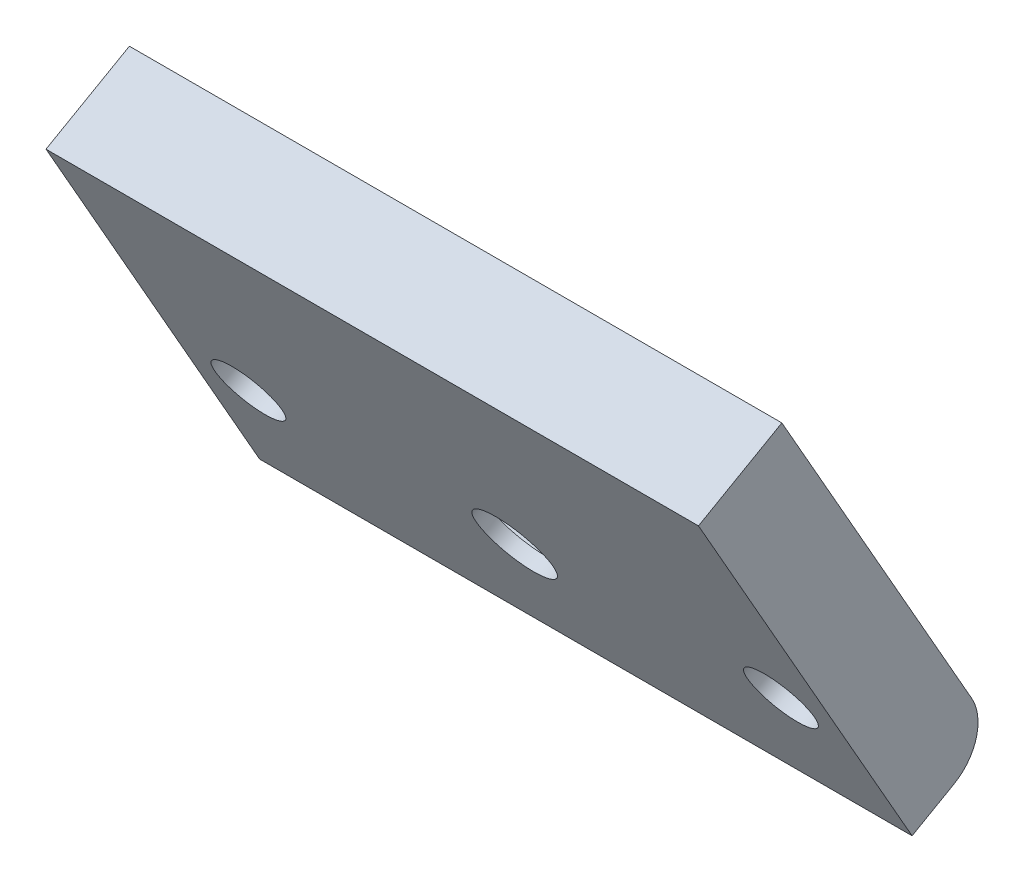
ISO-10303-21;
HEADER;
FILE_DESCRIPTION(('STEP AP214'),'2;1');
FILE_NAME('part.step','',(''),(''),'','','');
FILE_SCHEMA(('AUTOMOTIVE_DESIGN { 1 0 10303 214 1 1 1 1 }'));
ENDSEC;
DATA;
#1=APPLICATION_CONTEXT('core data for automotive mechanical design processes');
#2=APPLICATION_PROTOCOL_DEFINITION('international standard','automotive_design',2000,#1);
#3=PRODUCT_CONTEXT('',#1,'mechanical');
#4=PRODUCT('Part','Part','',(#3));
#5=PRODUCT_RELATED_PRODUCT_CATEGORY('part','',(#4));
#6=PRODUCT_DEFINITION_FORMATION('','',#4);
#7=PRODUCT_DEFINITION_CONTEXT('part definition',#1,'design');
#8=PRODUCT_DEFINITION('design','',#6,#7);
#9=PRODUCT_DEFINITION_SHAPE('','',#8);
#10=(LENGTH_UNIT() NAMED_UNIT(*) SI_UNIT(.MILLI.,.METRE.));
#11=(NAMED_UNIT(*) PLANE_ANGLE_UNIT() SI_UNIT($,.RADIAN.));
#12=(NAMED_UNIT(*) SI_UNIT($,.STERADIAN.) SOLID_ANGLE_UNIT());
#13=UNCERTAINTY_MEASURE_WITH_UNIT(LENGTH_MEASURE(1.E-05),#10,'distance_accuracy_value','');
#14=(GEOMETRIC_REPRESENTATION_CONTEXT(3) GLOBAL_UNCERTAINTY_ASSIGNED_CONTEXT((#13)) GLOBAL_UNIT_ASSIGNED_CONTEXT((#10,
#11,#12)) REPRESENTATION_CONTEXT('',''));
#15=CARTESIAN_POINT('',(0.,0.,0.));
#16=DIRECTION('',(0.,0.,1.));
#17=DIRECTION('',(1.,0.,0.));
#18=AXIS2_PLACEMENT_3D('',#15,#16,#17);
#19=CARTESIAN_POINT('',(0.,63.9753871113085,-6.9269396750915));
#20=DIRECTION('',(0.,-0.494736971942379,0.869042765687216));
#21=DIRECTION('',(0.,-0.869042765687216,-0.494736971942379));
#22=AXIS2_PLACEMENT_3D('',#19,#20,#21);
#23=CYLINDRICAL_SURFACE('',#22,4.00000000000001);
#24=CARTESIAN_POINT('',(0.,57.0490695041152,5.23965904452954));
#25=DIRECTION('',(0.,-0.494736971942379,0.869042765687216));
#26=DIRECTION('',(0.,-0.869042765687216,-0.494736971942379));
#27=AXIS2_PLACEMENT_3D('',#24,#25,#26);
#28=CIRCLE('',#27,4.00000000000001);
#29=CARTESIAN_POINT('',(0.,53.5728984413663,3.26071115676001));
#30=VERTEX_POINT('',#29);
#31=EDGE_CURVE('E162',#30,#30,#28,.T.);
#32=ORIENTED_EDGE('',*,*,#31,.F.);
#33=EDGE_LOOP('',(#32));
#34=FACE_BOUND('',#33,.T.);
#35=CARTESIAN_POINT('',(0.,56.3069640462016,6.54322319306035));
#36=DIRECTION('',(0.,-0.494736971942379,0.869042765687216));
#37=DIRECTION('',(0.,-0.869042765687216,-0.494736971942379));
#38=AXIS2_PLACEMENT_3D('',#35,#36,#37);
#39=CIRCLE('',#38,4.00000000000001);
#40=CARTESIAN_POINT('',(0.,52.8307929834527,4.56427530529083));
#41=VERTEX_POINT('',#40);
#42=EDGE_CURVE('E49',#41,#41,#39,.T.);
#43=ORIENTED_EDGE('',*,*,#42,.T.);
#44=EDGE_LOOP('',(#43));
#45=FACE_BOUND('',#44,.T.);
#46=ADVANCED_FACE('F44',(#34,#45),#23,.F.);
#47=CARTESIAN_POINT('',(0.,32.3026100272467,18.3895385839591));
#48=DIRECTION('',(0.,0.869042765687216,0.494736971942379));
#49=DIRECTION('',(0.,-0.494736971942379,0.869042765687216));
#50=AXIS2_PLACEMENT_3D('',#47,#48,#49);
#51=PLANE('',#50);
#52=CARTESIAN_POINT('',(-17.5,45.2502704486629,-4.3540024488242));
#53=DIRECTION('',(0.,0.869042765687216,0.494736971942379));
#54=DIRECTION('',(0.,-0.494736971942379,0.869042765687216));
#55=AXIS2_PLACEMENT_3D('',#52,#53,#54);
#56=CIRCLE('',#55,7.5);
#57=CARTESIAN_POINT('',(-17.5,41.5397431590951,2.16381829382992));
#58=VERTEX_POINT('',#57);
#59=CARTESIAN_POINT('',(-10.4289321881345,44.0134280188069,-2.18139553460614));
#60=VERTEX_POINT('',#59);
#61=EDGE_CURVE('E167',#58,#60,#56,.T.);
#62=ORIENTED_EDGE('',*,*,#61,.T.);
#63=DIRECTION('',(1.,0.,0.));
#64=VECTOR('',#63,1.);
#65=CARTESIAN_POINT('',(-17.5,44.0134280188069,-2.18139553460615));
#66=LINE('',#65,#64);
#67=CARTESIAN_POINT('',(10.4289321881345,44.013428018807,-2.18139553460616));
#68=VERTEX_POINT('',#67);
#69=EDGE_CURVE('E158',#60,#68,#66,.T.);
#70=ORIENTED_EDGE('',*,*,#69,.T.);
#71=CARTESIAN_POINT('',(17.5,45.2502704486629,-4.3540024488242));
#72=DIRECTION('',(0.,0.869042765687216,0.494736971942379));
#73=DIRECTION('',(0.,-0.494736971942379,0.869042765687216));
#74=AXIS2_PLACEMENT_3D('',#71,#72,#73);
#75=CIRCLE('',#74,7.5);
#76=CARTESIAN_POINT('',(17.5,41.5397431590951,2.16381829382992));
#77=VERTEX_POINT('',#76);
#78=EDGE_CURVE('E177',#68,#77,#75,.T.);
#79=ORIENTED_EDGE('',*,*,#78,.T.);
#80=DIRECTION('',(-1.,0.,0.));
#81=VECTOR('',#80,1.);
#82=CARTESIAN_POINT('',(0.,41.5397431590951,2.16381829382991));
#83=LINE('',#82,#81);
#84=CARTESIAN_POINT('',(34.,41.5397431590951,2.16381829382991));
#85=VERTEX_POINT('',#84);
#86=EDGE_CURVE('E187',#77,#85,#83,.F.);
#87=ORIENTED_EDGE('',*,*,#86,.T.);
#88=DIRECTION('',(0.,0.494736971942379,-0.869042765687216));
#89=VECTOR('',#88,1.);
#90=CARTESIAN_POINT('',(34.,44.0134280188069,-2.18139553460617));
#91=LINE('',#90,#89);
#92=CARTESIAN_POINT('',(34.,39.0660582993832,6.50903212226599));
#93=VERTEX_POINT('',#92);
#94=EDGE_CURVE('E244',#93,#85,#91,.T.);
#95=ORIENTED_EDGE('',*,*,#94,.F.);
#96=DIRECTION('',(1.,0.,0.));
#97=VECTOR('',#96,1.);
#98=CARTESIAN_POINT('',(-33.9999999999999,39.0660582993832,6.50903212226599));
#99=LINE('',#98,#97);
#100=CARTESIAN_POINT('',(-33.9999999999999,39.0660582993832,6.50903212226599));
#101=VERTEX_POINT('',#100);
#102=EDGE_CURVE('E241',#101,#93,#99,.T.);
#103=ORIENTED_EDGE('',*,*,#102,.F.);
#104=DIRECTION('',(0.,-0.494736971942379,0.869042765687216));
#105=VECTOR('',#104,1.);
#106=CARTESIAN_POINT('',(-33.9999999999999,44.0134280188069,-2.18139553460617));
#107=LINE('',#106,#105);
#108=CARTESIAN_POINT('',(-33.9999999999999,41.5397431590951,2.16381829382991));
#109=VERTEX_POINT('',#108);
#110=EDGE_CURVE('E239',#109,#101,#107,.T.);
#111=ORIENTED_EDGE('',*,*,#110,.F.);
#112=DIRECTION('',(-1.,0.,0.));
#113=VECTOR('',#112,1.);
#114=CARTESIAN_POINT('',(0.,41.5397431590951,2.16381829382991));
#115=LINE('',#114,#113);
#116=EDGE_CURVE('E190',#109,#58,#115,.F.);
#117=ORIENTED_EDGE('',*,*,#116,.T.);
#118=EDGE_LOOP('',(#62,#70,#79,#87,#95,#103,#111,#117));
#119=FACE_BOUND('',#118,.T.);
#120=ADVANCED_FACE('F266',(#119),#51,.F.);
#121=CARTESIAN_POINT('',(-33.9999999999999,129.815203137695,46.6646590965853));
#122=DIRECTION('',(0.,-0.494736971942379,0.869042765687216));
#123=DIRECTION('',(0.,-0.869042765687216,-0.494736971942379));
#124=AXIS2_PLACEMENT_3D('',#121,#122,#123);
#125=PLANE('',#124);
#126=CARTESIAN_POINT('',(27.75,57.0490695041152,5.23965904452953));
#127=DIRECTION('',(0.,-0.494736971942379,0.869042765687216));
#128=DIRECTION('',(0.,-0.869042765687216,-0.494736971942379));
#129=AXIS2_PLACEMENT_3D('',#126,#127,#128);
#130=CIRCLE('',#129,3.5);
#131=CARTESIAN_POINT('',(27.75,54.0074198242099,3.50807964273121));
#132=VERTEX_POINT('',#131);
#133=EDGE_CURVE('E236',#132,#132,#130,.T.);
#134=ORIENTED_EDGE('',*,*,#133,.T.);
#135=EDGE_LOOP('',(#134));
#136=FACE_BOUND('',#135,.T.);
#137=DIRECTION('',(-1.,0.,0.));
#138=VECTOR('',#137,1.);
#139=CARTESIAN_POINT('',(-33.9999999999999,48.358641847243,0.292289325105728));
#140=LINE('',#139,#138);
#141=CARTESIAN_POINT('',(34.,48.358641847243,0.292289325105742));
#142=VERTEX_POINT('',#141);
#143=CARTESIAN_POINT('',(17.5,48.358641847243,0.2922893251057));
#144=VERTEX_POINT('',#143);
#145=EDGE_CURVE('E54',#142,#144,#140,.T.);
#146=ORIENTED_EDGE('',*,*,#145,.T.);
#147=CARTESIAN_POINT('',(17.5,48.358641847243,0.292289325105733));
#148=CARTESIAN_POINT('',(17.4972783447475,48.3552968996487,0.290385081368294));
#149=CARTESIAN_POINT('',(17.4945566894576,48.3519519524825,0.288480837874573));
#150=CARTESIAN_POINT('',(17.2482797809468,48.0492765152582,0.116170872006276));
#151=CARTESIAN_POINT('',(17.0046375412352,47.7500030570262,-0.0542023827452684));
#152=CARTESIAN_POINT('',(16.501529448405,47.1610094459144,-0.389510295267227));
#153=CARTESIAN_POINT('',(16.2420552930662,46.871294430298,-0.554442028447173));
#154=CARTESIAN_POINT('',(15.8322203237664,46.4531510742017,-0.792486674810817));
#155=CARTESIAN_POINT('',(15.6925711393815,46.3168500769668,-0.870081409278725));
#156=CARTESIAN_POINT('',(15.4050861749062,46.0509617602916,-1.02144885155031));
#157=CARTESIAN_POINT('',(15.2572527389976,45.9213725387982,-1.09522264217307));
#158=CARTESIAN_POINT('',(14.9527456048189,45.6706985182819,-1.23792874450946));
#159=CARTESIAN_POINT('',(14.7960869769176,45.5495999692563,-1.30686888395606));
#160=CARTESIAN_POINT('',(14.4732920928158,45.3174148596934,-1.43904944234827));
#161=CARTESIAN_POINT('',(14.3071601698682,45.2063237806089,-1.50229243365567));
#162=CARTESIAN_POINT('',(13.9951397677771,45.0142039942232,-1.61166422192607));
#163=CARTESIAN_POINT('',(13.8507717793648,44.9313108204535,-1.65885444018082));
#164=CARTESIAN_POINT('',(13.5557055117445,44.7744796910013,-1.74813676454391));
#165=CARTESIAN_POINT('',(13.4050072086434,44.7005417691234,-1.79022885140762));
#166=CARTESIAN_POINT('',(13.0974326961294,44.562470800823,-1.868831211921));
#167=CARTESIAN_POINT('',(12.9405464270314,44.4983546235233,-1.90533188215524));
#168=CARTESIAN_POINT('',(12.6214595559997,44.3810019766351,-1.97213951862982));
#169=CARTESIAN_POINT('',(12.4592590268308,44.3277653581519,-2.00244656963435));
#170=CARTESIAN_POINT('',(12.129336843026,44.2327309764043,-2.05654865081223));
#171=CARTESIAN_POINT('',(11.9615870317053,44.1910067356895,-2.0803018253657));
#172=CARTESIAN_POINT('',(11.6225676690071,44.1202187450019,-2.12060068929444));
#173=CARTESIAN_POINT('',(11.451298052196,44.0911552306169,-2.13714624455197));
#174=CARTESIAN_POINT('',(11.106681542022,44.0463818353764,-2.16263527093764));
#175=CARTESIAN_POINT('',(10.9333377018539,44.0306543113612,-2.17158878613232));
#176=CARTESIAN_POINT('',(10.5857260212049,44.0130124621464,-2.18163210667377));
#177=CARTESIAN_POINT('',(10.4114582899538,44.0110965389334,-2.1827228217528));
#178=CARTESIAN_POINT('',(10.0713890449694,44.0212064268466,-2.1769673681315));
#179=CARTESIAN_POINT('',(9.9055628061606,44.0326023960148,-2.17047976188101));
#180=CARTESIAN_POINT('',(9.57580640255127,44.0684833885293,-2.15005308751258));
#181=CARTESIAN_POINT('',(9.41187600482867,44.0929667861265,-2.13611494491665));
#182=CARTESIAN_POINT('',(9.08642489886856,44.1552332217919,-2.10066731327983));
#183=CARTESIAN_POINT('',(8.92492271282494,44.193089623232,-2.07911605923733));
#184=CARTESIAN_POINT('',(8.60668414699584,44.2819374466473,-2.0285359211179));
#185=CARTESIAN_POINT('',(8.44995037749486,44.3329359230733,-1.99950302101579));
#186=CARTESIAN_POINT('',(8.29639623176819,44.3904157879339,-1.96678033415663));
#187=B_SPLINE_CURVE_WITH_KNOTS('',3,(#147,#148,#149,#150,#151,#152,#153,#154,#155,#156,#157,
#158,#159,#160,#161,#162,#163,#164,#165,#166,#167,#168,#169,#170,#171,#172,#173,#174,#175,#176,
#177,#178,#179,#180,#181,#182,#183,#184,#185,#186),.UNSPECIFIED.,.F.,.F.,(4,2,2,2,2,2,2,2,2,2,2,
2,2,2,2,2,2,2,2,4),(0.,0.0141421356237371,1.27968723730022,2.54590178874079,3.17565790924472,
3.80523457524021,4.43376694260518,5.06201407910895,5.58072849719426,6.09944487328203,
6.61904240458121,7.13863282433377,7.66146854427636,8.1843139926111,8.70646664631714,
9.22855888557431,9.72691642543553,10.2252120726089,10.7262849084398,11.2276272742767),.UNSPECIFIED.);
#188=EDGE_CURVE('E68',#144,#68,#187,.T.);
#189=ORIENTED_EDGE('',*,*,#188,.T.);
#190=ORIENTED_EDGE('',*,*,#69,.F.);
#191=CARTESIAN_POINT('',(-17.5,48.358641847243,0.292289325105741));
#192=CARTESIAN_POINT('',(-17.4972783447492,48.3552968996477,0.290385081367716));
#193=CARTESIAN_POINT('',(-17.4945566894609,48.3519519524804,0.28848083787342));
#194=CARTESIAN_POINT('',(-17.2482797811133,48.0492765151861,0.116170871965661));
#195=CARTESIAN_POINT('',(-17.0046375413075,47.7500030570426,-0.0542023827358426));
#196=CARTESIAN_POINT('',(-16.5015294484333,47.1610094460159,-0.389510295209537));
#197=CARTESIAN_POINT('',(-16.2420552931447,46.8712944303962,-0.554442028391253));
#198=CARTESIAN_POINT('',(-15.832220323883,46.4531510743116,-0.792486674748238));
#199=CARTESIAN_POINT('',(-15.6925711395027,46.3168500770816,-0.870081409213301));
#200=CARTESIAN_POINT('',(-15.4050861750407,46.0509617604132,-1.02144885148109));
#201=CARTESIAN_POINT('',(-15.2572527391406,45.9213725389215,-1.09522264210288));
#202=CARTESIAN_POINT('',(-14.9527456049808,45.6706985184096,-1.23792874443674));
#203=CARTESIAN_POINT('',(-14.7960869770901,45.5495999693867,-1.30686888388183));
#204=CARTESIAN_POINT('',(-14.4732920930108,45.3174148598275,-1.43904944227196));
#205=CARTESIAN_POINT('',(-14.3071601700753,45.2063237807439,-1.50229243357878));
#206=CARTESIAN_POINT('',(-13.995139767996,45.0142039943517,-1.61166422185287));
#207=CARTESIAN_POINT('',(-13.8507717795829,44.9313108205755,-1.65885444011138));
#208=CARTESIAN_POINT('',(-13.5557055119598,44.7744796911098,-1.74813676448217));
#209=CARTESIAN_POINT('',(-13.4050072088568,44.700541769225,-1.79022885134981));
#210=CARTESIAN_POINT('',(-13.0974326963416,44.5624708009125,-1.86883121187004));
#211=CARTESIAN_POINT('',(-12.9405464272446,44.4983546236074,-1.90533188210734));
#212=CARTESIAN_POINT('',(-12.6214595562146,44.3810019767084,-1.97213951858808));
#213=CARTESIAN_POINT('',(-12.4592590270465,44.3277653582198,-2.00244656959573));
#214=CARTESIAN_POINT('',(-12.1293368432417,44.2327309764607,-2.05654865078011));
#215=CARTESIAN_POINT('',(-11.9615870319203,44.1910067357401,-2.08030182533692));
#216=CARTESIAN_POINT('',(-11.62256766922,44.1202187450407,-2.12060068927233));
#217=CARTESIAN_POINT('',(-11.4512980524074,44.0911552306499,-2.13714624453317));
#218=CARTESIAN_POINT('',(-11.1066815422282,44.0463818353977,-2.16263527092551));
#219=CARTESIAN_POINT('',(-10.9333377020564,44.0306543113768,-2.17158878612346));
#220=CARTESIAN_POINT('',(-10.5857260213991,44.013012462151,-2.18163210667115));
#221=CARTESIAN_POINT('',(-10.4114582901435,44.0110965389328,-2.18272282175314));
#222=CARTESIAN_POINT('',(-10.0713890451511,44.0212064268364,-2.17696736813729));
#223=CARTESIAN_POINT('',(-9.90556280633862,44.0326023960001,-2.17047976188937));
#224=CARTESIAN_POINT('',(-9.57580640272153,44.0684833885061,-2.15005308752578));
#225=CARTESIAN_POINT('',(-9.41187600499485,44.0929667860993,-2.13611494493214));
#226=CARTESIAN_POINT('',(-9.0864248990283,44.1552332217567,-2.10066731329984));
#227=CARTESIAN_POINT('',(-8.92492271298228,44.1930896231928,-2.07911605925966));
#228=CARTESIAN_POINT('',(-8.60668414714796,44.2819374466001,-2.02853592114474));
#229=CARTESIAN_POINT('',(-8.44995037764417,44.3329359230222,-1.99950302104483));
#230=CARTESIAN_POINT('',(-8.29639623191448,44.3904157878791,-1.96678033418778));
#231=B_SPLINE_CURVE_WITH_KNOTS('',3,(#191,#192,#193,#194,#195,#196,#197,#198,#199,#200,#201,
#202,#203,#204,#205,#206,#207,#208,#209,#210,#211,#212,#213,#214,#215,#216,#217,#218,#219,#220,
#221,#222,#223,#224,#225,#226,#227,#228,#229,#230),.UNSPECIFIED.,.F.,.F.,(4,2,2,2,2,2,2,2,2,2,2,
2,2,2,2,2,2,2,2,4),(0.,0.0141421356237378,1.2796872372145,2.54590178857722,3.1756579090579,
3.80523457503174,4.43376694236693,5.06201407884021,5.58072849694005,6.0994448730447,
6.61904240434918,7.13863282410621,7.66146854405651,8.18431399239926,8.70646664611873,
9.22855888538931,9.72691642526022,10.2252120724433,10.7262849082774,11.2276272741176),.UNSPECIFIED.);
#232=CARTESIAN_POINT('',(-17.5,48.358641847243,0.292289325105752));
#233=VERTEX_POINT('',#232);
#234=EDGE_CURVE('E148',#60,#233,#231,.F.);
#235=ORIENTED_EDGE('',*,*,#234,.T.);
#236=DIRECTION('',(-1.,0.,0.));
#237=VECTOR('',#236,1.);
#238=CARTESIAN_POINT('',(-33.9999999999999,48.358641847243,0.292289325105728));
#239=LINE('',#238,#237);
#240=CARTESIAN_POINT('',(-33.9999999999999,48.358641847243,0.292289325105742));
#241=VERTEX_POINT('',#240);
#242=EDGE_CURVE('E155',#233,#241,#239,.T.);
#243=ORIENTED_EDGE('',*,*,#242,.T.);
#244=DIRECTION('',(0.,-0.869042765687216,-0.494736971942379));
#245=VECTOR('',#244,1.);
#246=CARTESIAN_POINT('',(-33.9999999999999,129.815203137695,46.6646590965853));
#247=LINE('',#246,#245);
#248=CARTESIAN_POINT('',(-33.9999999999999,83.1203524747318,20.081768202801));
#249=VERTEX_POINT('',#248);
#250=EDGE_CURVE('E246',#249,#241,#247,.T.);
#251=ORIENTED_EDGE('',*,*,#250,.F.);
#252=DIRECTION('',(-1.,0.,0.));
#253=VECTOR('',#252,1.);
#254=CARTESIAN_POINT('',(-33.9999999999999,83.1203524747318,20.081768202801));
#255=LINE('',#254,#253);
#256=CARTESIAN_POINT('',(34.,83.1203524747318,20.081768202801));
#257=VERTEX_POINT('',#256);
#258=EDGE_CURVE('E193',#257,#249,#255,.T.);
#259=ORIENTED_EDGE('',*,*,#258,.F.);
#260=DIRECTION('',(0.,-0.869042765687216,-0.494736971942379));
#261=VECTOR('',#260,1.);
#262=CARTESIAN_POINT('',(34.,129.815203137695,46.6646590965853));
#263=LINE('',#262,#261);
#264=EDGE_CURVE('E248',#257,#142,#263,.T.);
#265=ORIENTED_EDGE('',*,*,#264,.T.);
#266=EDGE_LOOP('',(#146,#189,#190,#235,#243,#251,#259,#265));
#267=FACE_BOUND('',#266,.T.);
#268=ORIENTED_EDGE('',*,*,#31,.T.);
#269=EDGE_LOOP('',(#268));
#270=FACE_BOUND('',#269,.T.);
#271=CARTESIAN_POINT('',(-27.75,57.0490695041152,5.23965904452953));
#272=DIRECTION('',(0.,-0.494736971942379,0.869042765687216));
#273=DIRECTION('',(0.,-0.869042765687216,-0.494736971942379));
#274=AXIS2_PLACEMENT_3D('',#271,#272,#273);
#275=CIRCLE('',#274,3.5);
#276=CARTESIAN_POINT('',(-27.75,54.0074198242099,3.50807964273121));
#277=VERTEX_POINT('',#276);
#278=EDGE_CURVE('E233',#277,#277,#275,.T.);
#279=ORIENTED_EDGE('',*,*,#278,.T.);
#280=EDGE_LOOP('',(#279));
#281=FACE_BOUND('',#280,.T.);
#282=ADVANCED_FACE('F151',(#136,#267,#270,#281),#125,.F.);
#283=CARTESIAN_POINT('',(34.,129.815203137695,46.6646590965853));
#284=DIRECTION('',(-1.,0.,0.));
#285=DIRECTION('',(0.,0.,1.));
#286=AXIS2_PLACEMENT_3D('',#283,#284,#285);
#287=PLANE('',#286);
#288=ORIENTED_EDGE('',*,*,#94,.T.);
#289=CARTESIAN_POINT('',(34.,45.8849569875311,4.63750315354181));
#290=DIRECTION('',(-1.,0.,0.));
#291=DIRECTION('',(0.,0.,1.));
#292=AXIS2_PLACEMENT_3D('',#289,#290,#291);
#293=CIRCLE('',#292,5.);
#294=EDGE_CURVE('E11',#85,#142,#293,.F.);
#295=ORIENTED_EDGE('',*,*,#294,.T.);
#296=ORIENTED_EDGE('',*,*,#264,.F.);
#297=DIRECTION('',(0.,0.49473697194238,-0.869042765687216));
#298=VECTOR('',#297,1.);
#299=CARTESIAN_POINT('',(34.,83.1203524747318,20.081768202801));
#300=LINE('',#299,#298);
#301=CARTESIAN_POINT('',(34.,78.172982755308,28.7721958596732));
#302=VERTEX_POINT('',#301);
#303=EDGE_CURVE('E229',#302,#257,#300,.T.);
#304=ORIENTED_EDGE('',*,*,#303,.F.);
#305=DIRECTION('',(0.,-0.869042765687216,-0.494736971942379));
#306=VECTOR('',#305,1.);
#307=CARTESIAN_POINT('',(34.,124.867833418271,55.3550867534574));
#308=LINE('',#307,#306);
#309=EDGE_CURVE('E180',#302,#93,#308,.T.);
#310=ORIENTED_EDGE('',*,*,#309,.T.);
#311=EDGE_LOOP('',(#288,#295,#296,#304,#310));
#312=FACE_BOUND('',#311,.T.);
#313=ADVANCED_FACE('F265',(#312),#287,.F.);
#314=CARTESIAN_POINT('',(-33.9999999999999,124.867833418271,55.3550867534574));
#315=DIRECTION('',(0.,0.494736971942379,-0.869042765687216));
#316=DIRECTION('',(0.,0.869042765687216,0.494736971942379));
#317=AXIS2_PLACEMENT_3D('',#314,#315,#316);
#318=PLANE('',#317);
#319=CARTESIAN_POINT('',(0.,52.1016997846914,13.9300867014017));
#320=DIRECTION('',(0.,0.494736971942379,-0.869042765687216));
#321=DIRECTION('',(0.,0.869042765687216,0.494736971942379));
#322=AXIS2_PLACEMENT_3D('',#319,#320,#321);
#323=CIRCLE('',#322,4.00000000000001);
#324=CARTESIAN_POINT('',(0.,55.5778708474403,15.9090345891712));
#325=VERTEX_POINT('',#324);
#326=EDGE_CURVE('E200',#325,#325,#323,.F.);
#327=ORIENTED_EDGE('',*,*,#326,.F.);
#328=EDGE_LOOP('',(#327));
#329=FACE_BOUND('',#328,.T.);
#330=CARTESIAN_POINT('',(27.75,52.1016997846914,13.9300867014017));
#331=DIRECTION('',(0.,0.494736971942379,-0.869042765687216));
#332=DIRECTION('',(0.,0.869042765687216,0.494736971942379));
#333=AXIS2_PLACEMENT_3D('',#330,#331,#332);
#334=CIRCLE('',#333,3.5);
#335=CARTESIAN_POINT('',(27.75,55.1433494645967,15.6616661032));
#336=VERTEX_POINT('',#335);
#337=EDGE_CURVE('E183',#336,#336,#334,.T.);
#338=ORIENTED_EDGE('',*,*,#337,.T.);
#339=EDGE_LOOP('',(#338));
#340=FACE_BOUND('',#339,.T.);
#341=CARTESIAN_POINT('',(-27.75,52.1016997846914,13.9300867014017));
#342=DIRECTION('',(0.,0.494736971942379,-0.869042765687216));
#343=DIRECTION('',(0.,0.869042765687216,0.494736971942379));
#344=AXIS2_PLACEMENT_3D('',#341,#342,#343);
#345=CIRCLE('',#344,3.5);
#346=CARTESIAN_POINT('',(-27.75,55.1433494645967,15.6616661032));
#347=VERTEX_POINT('',#346);
#348=EDGE_CURVE('E170',#347,#347,#345,.T.);
#349=ORIENTED_EDGE('',*,*,#348,.T.);
#350=EDGE_LOOP('',(#349));
#351=FACE_BOUND('',#350,.T.);
#352=ORIENTED_EDGE('',*,*,#309,.F.);
#353=DIRECTION('',(1.,0.,0.));
#354=VECTOR('',#353,1.);
#355=CARTESIAN_POINT('',(-33.9999999999999,78.172982755308,28.7721958596732));
#356=LINE('',#355,#354);
#357=CARTESIAN_POINT('',(-33.9999999999999,78.172982755308,28.7721958596732));
#358=VERTEX_POINT('',#357);
#359=EDGE_CURVE('E226',#358,#302,#356,.T.);
#360=ORIENTED_EDGE('',*,*,#359,.F.);
#361=DIRECTION('',(0.,-0.869042765687216,-0.494736971942379));
#362=VECTOR('',#361,1.);
#363=CARTESIAN_POINT('',(-33.9999999999999,124.867833418271,55.3550867534574));
#364=LINE('',#363,#362);
#365=EDGE_CURVE('E175',#358,#101,#364,.T.);
#366=ORIENTED_EDGE('',*,*,#365,.T.);
#367=ORIENTED_EDGE('',*,*,#102,.T.);
#368=EDGE_LOOP('',(#352,#360,#366,#367));
#369=FACE_BOUND('',#368,.T.);
#370=ADVANCED_FACE('F253',(#329,#340,#351,#369),#318,.F.);
#371=CARTESIAN_POINT('',(-33.9999999999999,129.815203137695,46.6646590965853));
#372=DIRECTION('',(1.,0.,0.));
#373=DIRECTION('',(0.,0.,-1.));
#374=AXIS2_PLACEMENT_3D('',#371,#372,#373);
#375=PLANE('',#374);
#376=ORIENTED_EDGE('',*,*,#250,.T.);
#377=CARTESIAN_POINT('',(-33.9999999999999,45.8849569875311,4.63750315354181));
#378=DIRECTION('',(1.,0.,0.));
#379=DIRECTION('',(0.,0.,-1.));
#380=AXIS2_PLACEMENT_3D('',#377,#378,#379);
#381=CIRCLE('',#380,5.);
#382=EDGE_CURVE('E174',#241,#109,#381,.F.);
#383=ORIENTED_EDGE('',*,*,#382,.T.);
#384=ORIENTED_EDGE('',*,*,#110,.T.);
#385=ORIENTED_EDGE('',*,*,#365,.F.);
#386=DIRECTION('',(0.,-0.49473697194238,0.869042765687216));
#387=VECTOR('',#386,1.);
#388=CARTESIAN_POINT('',(-33.9999999999999,83.1203524747318,20.081768202801));
#389=LINE('',#388,#387);
#390=EDGE_CURVE('E223',#249,#358,#389,.T.);
#391=ORIENTED_EDGE('',*,*,#390,.F.);
#392=EDGE_LOOP('',(#376,#383,#384,#385,#391));
#393=FACE_BOUND('',#392,.T.);
#394=ADVANCED_FACE('F260',(#393),#375,.F.);
#395=CARTESIAN_POINT('',(-27.75,30.7892203841667,51.367062493138));
#396=DIRECTION('',(0.,0.494736971942379,-0.869042765687216));
#397=DIRECTION('',(0.,0.869042765687216,0.494736971942379));
#398=AXIS2_PLACEMENT_3D('',#395,#396,#397);
#399=CYLINDRICAL_SURFACE('',#398,3.5);
#400=ORIENTED_EDGE('',*,*,#348,.F.);
#401=EDGE_LOOP('',(#400));
#402=FACE_BOUND('',#401,.T.);
#403=ORIENTED_EDGE('',*,*,#278,.F.);
#404=EDGE_LOOP('',(#403));
#405=FACE_BOUND('',#404,.T.);
#406=ADVANCED_FACE('F256',(#402,#405),#399,.F.);
#407=CARTESIAN_POINT('',(27.75,30.7892203841667,51.367062493138));
#408=DIRECTION('',(0.,0.494736971942379,-0.869042765687216));
#409=DIRECTION('',(0.,0.869042765687216,0.494736971942379));
#410=AXIS2_PLACEMENT_3D('',#407,#408,#409);
#411=CYLINDRICAL_SURFACE('',#410,3.5);
#412=ORIENTED_EDGE('',*,*,#337,.F.);
#413=EDGE_LOOP('',(#412));
#414=FACE_BOUND('',#413,.T.);
#415=ORIENTED_EDGE('',*,*,#133,.F.);
#416=EDGE_LOOP('',(#415));
#417=FACE_BOUND('',#416,.T.);
#418=ADVANCED_FACE('F259',(#414,#417),#411,.F.);
#419=CARTESIAN_POINT('',(-17.5,49.595484277099,-1.88031758911231));
#420=DIRECTION('',(0.,0.869042765687216,0.494736971942379));
#421=DIRECTION('',(0.,-0.494736971942379,0.869042765687216));
#422=AXIS2_PLACEMENT_3D('',#419,#420,#421);
#423=TOROIDAL_SURFACE('',#422,7.5,5.);
#424=ORIENTED_EDGE('',*,*,#234,.F.);
#425=ORIENTED_EDGE('',*,*,#61,.F.);
#426=CARTESIAN_POINT('',(-17.5,45.8849569875311,4.63750315354181));
#427=DIRECTION('',(-1.,0.,0.));
#428=DIRECTION('',(0.,0.,1.));
#429=AXIS2_PLACEMENT_3D('',#426,#427,#428);
#430=CIRCLE('',#429,5.);
#431=EDGE_CURVE('E165',#233,#58,#430,.T.);
#432=ORIENTED_EDGE('',*,*,#431,.F.);
#433=EDGE_LOOP('',(#424,#425,#432));
#434=FACE_BOUND('',#433,.T.);
#435=ADVANCED_FACE('F166',(#434),#423,.T.);
#436=CARTESIAN_POINT('',(-33.9999999999999,45.8849569875311,4.63750315354181));
#437=DIRECTION('',(-1.,0.,0.));
#438=DIRECTION('',(0.,-1.,0.));
#439=AXIS2_PLACEMENT_3D('',#436,#437,#438);
#440=CYLINDRICAL_SURFACE('',#439,5.);
#441=ORIENTED_EDGE('',*,*,#431,.T.);
#442=ORIENTED_EDGE('',*,*,#116,.F.);
#443=ORIENTED_EDGE('',*,*,#382,.F.);
#444=ORIENTED_EDGE('',*,*,#242,.F.);
#445=EDGE_LOOP('',(#441,#442,#443,#444));
#446=FACE_BOUND('',#445,.T.);
#447=ADVANCED_FACE('F173',(#446),#440,.T.);
#448=CARTESIAN_POINT('',(17.5,49.595484277099,-1.88031758911231));
#449=DIRECTION('',(0.,0.869042765687216,0.494736971942379));
#450=DIRECTION('',(0.,-0.494736971942379,0.869042765687216));
#451=AXIS2_PLACEMENT_3D('',#448,#449,#450);
#452=TOROIDAL_SURFACE('',#451,7.5,5.);
#453=ORIENTED_EDGE('',*,*,#188,.F.);
#454=CARTESIAN_POINT('',(17.5,45.8849569875311,4.63750315354181));
#455=DIRECTION('',(1.,0.,0.));
#456=DIRECTION('',(0.,0.,-1.));
#457=AXIS2_PLACEMENT_3D('',#454,#455,#456);
#458=CIRCLE('',#457,5.);
#459=EDGE_CURVE('E171',#77,#144,#458,.T.);
#460=ORIENTED_EDGE('',*,*,#459,.F.);
#461=ORIENTED_EDGE('',*,*,#78,.F.);
#462=EDGE_LOOP('',(#453,#460,#461));
#463=FACE_BOUND('',#462,.T.);
#464=ADVANCED_FACE('F46',(#463),#452,.T.);
#465=CARTESIAN_POINT('',(-33.9999999999999,45.8849569875311,4.63750315354181));
#466=DIRECTION('',(-1.,0.,0.));
#467=DIRECTION('',(0.,-1.,0.));
#468=AXIS2_PLACEMENT_3D('',#465,#466,#467);
#469=CYLINDRICAL_SURFACE('',#468,5.);
#470=ORIENTED_EDGE('',*,*,#294,.F.);
#471=ORIENTED_EDGE('',*,*,#86,.F.);
#472=ORIENTED_EDGE('',*,*,#459,.T.);
#473=ORIENTED_EDGE('',*,*,#145,.F.);
#474=EDGE_LOOP('',(#470,#471,#472,#473));
#475=FACE_BOUND('',#474,.T.);
#476=ADVANCED_FACE('F300',(#475),#469,.T.);
#477=CARTESIAN_POINT('',(0.,71.4095344831715,40.6527023213663));
#478=DIRECTION('',(0.,0.869042765687216,0.49473697194238));
#479=DIRECTION('',(0.,-0.49473697194238,0.869042765687216));
#480=AXIS2_PLACEMENT_3D('',#477,#478,#479);
#481=PLANE('',#480);
#482=ORIENTED_EDGE('',*,*,#390,.T.);
#483=ORIENTED_EDGE('',*,*,#359,.T.);
#484=ORIENTED_EDGE('',*,*,#303,.T.);
#485=ORIENTED_EDGE('',*,*,#258,.T.);
#486=EDGE_LOOP('',(#482,#483,#484,#485));
#487=FACE_BOUND('',#486,.T.);
#488=ADVANCED_FACE('F292',(#487),#481,.T.);
#489=CARTESIAN_POINT('',(0.,52.843805242605,12.6265225528709));
#490=DIRECTION('',(0.,-0.494736971942379,0.869042765687216));
#491=DIRECTION('',(0.,-0.869042765687216,-0.494736971942379));
#492=AXIS2_PLACEMENT_3D('',#489,#490,#491);
#493=CIRCLE('',#492,4.00000000000001);
#494=CARTESIAN_POINT('',(0.,49.3676341798561,10.6475746651013));
#495=VERTEX_POINT('',#494);
#496=EDGE_CURVE('E194',#495,#495,#493,.T.);
#497=ORIENTED_EDGE('',*,*,#496,.F.);
#498=EDGE_LOOP('',(#497));
#499=FACE_BOUND('',#498,.T.);
#500=ORIENTED_EDGE('',*,*,#326,.T.);
#501=EDGE_LOOP('',(#500));
#502=FACE_BOUND('',#501,.T.);
#503=ADVANCED_FACE('F281',(#499,#502),#23,.F.);
#504=CARTESIAN_POINT('',(6.06217782649106,59.3486137261069,8.2748025948587));
#505=DIRECTION('',(0.5,0.752613112060217,0.42845478589349));
#506=DIRECTION('',(-0.832939072330605,0.553364709558742,0.));
#507=AXIS2_PLACEMENT_3D('',#504,#505,#506);
#508=PLANE('',#507);
#509=DIRECTION('',(-0.866025403784439,0.434521382843608,0.24736848597119));
#510=VECTOR('',#509,1.);
#511=CARTESIAN_POINT('',(6.06217782649106,55.8854549225102,14.3581019546692));
#512=LINE('',#511,#510);
#513=CARTESIAN_POINT('',(6.06217782649106,55.8854549225102,14.3581019546692));
#514=VERTEX_POINT('',#513);
#515=CARTESIAN_POINT('',(0.,58.9271046024155,16.0896813564675));
#516=VERTEX_POINT('',#515);
#517=EDGE_CURVE('E379',#514,#516,#512,.T.);
#518=ORIENTED_EDGE('',*,*,#517,.T.);
#519=DIRECTION('',(0.,-0.494736971942379,0.869042765687216));
#520=VECTOR('',#519,1.);
#521=CARTESIAN_POINT('',(0.,62.3902634060121,10.006381996657));
#522=LINE('',#521,#520);
#523=CARTESIAN_POINT('',(0.,62.3902634060121,10.006381996657));
#524=VERTEX_POINT('',#523);
#525=EDGE_CURVE('E218',#524,#516,#522,.T.);
#526=ORIENTED_EDGE('',*,*,#525,.F.);
#527=DIRECTION('',(-0.866025403784439,0.434521382843608,0.24736848597119));
#528=VECTOR('',#527,1.);
#529=CARTESIAN_POINT('',(6.06217782649106,59.3486137261069,8.2748025948587));
#530=LINE('',#529,#528);
#531=CARTESIAN_POINT('',(6.06217782649106,59.3486137261069,8.2748025948587));
#532=VERTEX_POINT('',#531);
#533=EDGE_CURVE('E393',#532,#524,#530,.T.);
#534=ORIENTED_EDGE('',*,*,#533,.F.);
#535=DIRECTION('',(0.,-0.494736971942379,0.869042765687216));
#536=VECTOR('',#535,1.);
#537=CARTESIAN_POINT('',(6.06217782649106,59.3486137261069,8.2748025948587));
#538=LINE('',#537,#536);
#539=EDGE_CURVE('E196',#532,#514,#538,.T.);
#540=ORIENTED_EDGE('',*,*,#539,.T.);
#541=EDGE_LOOP('',(#518,#526,#534,#540));
#542=FACE_BOUND('',#541,.T.);
#543=ADVANCED_FACE('F291',(#542),#508,.F.);
#544=CARTESIAN_POINT('',(6.06217782649106,53.2653143662964,4.81164379126204));
#545=DIRECTION('',(1.,0.,0.));
#546=DIRECTION('',(0.,0.,-1.));
#547=AXIS2_PLACEMENT_3D('',#544,#545,#546);
#548=PLANE('',#547);
#549=DIRECTION('',(0.,0.869042765687216,0.49473697194238));
#550=VECTOR('',#549,1.);
#551=CARTESIAN_POINT('',(6.06217782649106,49.8021555626997,10.8949431510726));
#552=LINE('',#551,#550);
#553=CARTESIAN_POINT('',(6.06217782649106,49.8021555626997,10.8949431510726));
#554=VERTEX_POINT('',#553);
#555=EDGE_CURVE('E210',#554,#514,#552,.T.);
#556=ORIENTED_EDGE('',*,*,#555,.T.);
#557=ORIENTED_EDGE('',*,*,#539,.F.);
#558=DIRECTION('',(0.,0.869042765687216,0.49473697194238));
#559=VECTOR('',#558,1.);
#560=CARTESIAN_POINT('',(6.06217782649106,53.2653143662964,4.81164379126204));
#561=LINE('',#560,#559);
#562=CARTESIAN_POINT('',(6.06217782649106,53.2653143662964,4.81164379126204));
#563=VERTEX_POINT('',#562);
#564=EDGE_CURVE('E220',#563,#532,#561,.T.);
#565=ORIENTED_EDGE('',*,*,#564,.F.);
#566=DIRECTION('',(0.,-0.494736971942379,0.869042765687216));
#567=VECTOR('',#566,1.);
#568=CARTESIAN_POINT('',(6.06217782649106,53.2653143662964,4.81164379126204));
#569=LINE('',#568,#567);
#570=EDGE_CURVE('E201',#563,#554,#569,.T.);
#571=ORIENTED_EDGE('',*,*,#570,.T.);
#572=EDGE_LOOP('',(#556,#557,#565,#571));
#573=FACE_BOUND('',#572,.T.);
#574=ADVANCED_FACE('F299',(#573),#548,.F.);
#575=CARTESIAN_POINT('',(0.,50.2236646863911,3.08006438946371));
#576=DIRECTION('',(0.500000000000001,-0.752613112060216,-0.428454785893489));
#577=DIRECTION('',(0.832939072330605,0.553364709558743,0.));
#578=AXIS2_PLACEMENT_3D('',#575,#576,#577);
#579=PLANE('',#578);
#580=DIRECTION('',(0.866025403784438,0.434521382843608,0.24736848597119));
#581=VECTOR('',#580,1.);
#582=CARTESIAN_POINT('',(0.,46.7605058827945,9.16336374927423));
#583=LINE('',#582,#581);
#584=CARTESIAN_POINT('',(0.,46.7605058827945,9.16336374927423));
#585=VERTEX_POINT('',#584);
#586=EDGE_CURVE('E388',#585,#554,#583,.T.);
#587=ORIENTED_EDGE('',*,*,#586,.T.);
#588=ORIENTED_EDGE('',*,*,#570,.F.);
#589=DIRECTION('',(0.866025403784438,0.434521382843608,0.24736848597119));
#590=VECTOR('',#589,1.);
#591=CARTESIAN_POINT('',(0.,50.2236646863911,3.08006438946371));
#592=LINE('',#591,#590);
#593=CARTESIAN_POINT('',(0.,50.2236646863911,3.08006438946371));
#594=VERTEX_POINT('',#593);
#595=EDGE_CURVE('E407',#594,#563,#592,.T.);
#596=ORIENTED_EDGE('',*,*,#595,.F.);
#597=DIRECTION('',(0.,-0.494736971942379,0.869042765687216));
#598=VECTOR('',#597,1.);
#599=CARTESIAN_POINT('',(0.,50.2236646863911,3.08006438946371));
#600=LINE('',#599,#598);
#601=EDGE_CURVE('E207',#594,#585,#600,.T.);
#602=ORIENTED_EDGE('',*,*,#601,.T.);
#603=EDGE_LOOP('',(#587,#588,#596,#602));
#604=FACE_BOUND('',#603,.T.);
#605=ADVANCED_FACE('F353',(#604),#579,.F.);
#606=CARTESIAN_POINT('',(-6.06217782649106,53.2653143662964,4.81164379126204));
#607=DIRECTION('',(-0.500000000000001,-0.752613112060216,-0.428454785893489));
#608=DIRECTION('',(0.832939072330605,-0.553364709558743,0.));
#609=AXIS2_PLACEMENT_3D('',#606,#607,#608);
#610=PLANE('',#609);
#611=DIRECTION('',(0.866025403784438,-0.434521382843609,-0.24736848597119));
#612=VECTOR('',#611,1.);
#613=CARTESIAN_POINT('',(-6.06217782649106,49.8021555626997,10.8949431510726));
#614=LINE('',#613,#612);
#615=CARTESIAN_POINT('',(-6.06217782649106,49.8021555626997,10.8949431510726));
#616=VERTEX_POINT('',#615);
#617=EDGE_CURVE('E382',#616,#585,#614,.T.);
#618=ORIENTED_EDGE('',*,*,#617,.T.);
#619=ORIENTED_EDGE('',*,*,#601,.F.);
#620=DIRECTION('',(0.866025403784438,-0.434521382843609,-0.24736848597119));
#621=VECTOR('',#620,1.);
#622=CARTESIAN_POINT('',(-6.06217782649106,53.2653143662964,4.81164379126204));
#623=LINE('',#622,#621);
#624=CARTESIAN_POINT('',(-6.06217782649106,53.2653143662964,4.81164379126204));
#625=VERTEX_POINT('',#624);
#626=EDGE_CURVE('E404',#625,#594,#623,.T.);
#627=ORIENTED_EDGE('',*,*,#626,.F.);
#628=DIRECTION('',(0.,-0.494736971942379,0.869042765687216));
#629=VECTOR('',#628,1.);
#630=CARTESIAN_POINT('',(-6.06217782649106,53.2653143662964,4.81164379126204));
#631=LINE('',#630,#629);
#632=EDGE_CURVE('E214',#625,#616,#631,.T.);
#633=ORIENTED_EDGE('',*,*,#632,.T.);
#634=EDGE_LOOP('',(#618,#619,#627,#633));
#635=FACE_BOUND('',#634,.T.);
#636=ADVANCED_FACE('F357',(#635),#610,.F.);
#637=CARTESIAN_POINT('',(-6.06217782649106,59.3486137261069,8.27480259485869));
#638=DIRECTION('',(-1.,0.,0.));
#639=DIRECTION('',(0.,-1.,0.));
#640=AXIS2_PLACEMENT_3D('',#637,#638,#639);
#641=PLANE('',#640);
#642=DIRECTION('',(0.,-0.869042765687216,-0.49473697194238));
#643=VECTOR('',#642,1.);
#644=CARTESIAN_POINT('',(-6.06217782649106,55.8854549225102,14.3581019546692));
#645=LINE('',#644,#643);
#646=CARTESIAN_POINT('',(-6.06217782649106,55.8854549225102,14.3581019546692));
#647=VERTEX_POINT('',#646);
#648=EDGE_CURVE('E378',#647,#616,#645,.T.);
#649=ORIENTED_EDGE('',*,*,#648,.T.);
#650=ORIENTED_EDGE('',*,*,#632,.F.);
#651=DIRECTION('',(0.,-0.869042765687216,-0.49473697194238));
#652=VECTOR('',#651,1.);
#653=CARTESIAN_POINT('',(-6.06217782649106,59.3486137261069,8.27480259485869));
#654=LINE('',#653,#652);
#655=CARTESIAN_POINT('',(-6.06217782649106,59.3486137261069,8.27480259485869));
#656=VERTEX_POINT('',#655);
#657=EDGE_CURVE('E399',#656,#625,#654,.T.);
#658=ORIENTED_EDGE('',*,*,#657,.F.);
#659=DIRECTION('',(0.,-0.494736971942379,0.869042765687216));
#660=VECTOR('',#659,1.);
#661=CARTESIAN_POINT('',(-6.06217782649106,59.3486137261069,8.27480259485869));
#662=LINE('',#661,#660);
#663=EDGE_CURVE('E216',#656,#647,#662,.T.);
#664=ORIENTED_EDGE('',*,*,#663,.T.);
#665=EDGE_LOOP('',(#649,#650,#658,#664));
#666=FACE_BOUND('',#665,.T.);
#667=ADVANCED_FACE('F361',(#666),#641,.F.);
#668=CARTESIAN_POINT('',(0.,62.3902634060121,10.006381996657));
#669=DIRECTION('',(-0.500000000000001,0.752613112060216,0.428454785893489));
#670=DIRECTION('',(-0.832939072330605,-0.553364709558743,0.));
#671=AXIS2_PLACEMENT_3D('',#668,#669,#670);
#672=PLANE('',#671);
#673=DIRECTION('',(-0.866025403784438,-0.434521382843609,-0.24736848597119));
#674=VECTOR('',#673,1.);
#675=CARTESIAN_POINT('',(0.,58.9271046024155,16.0896813564675));
#676=LINE('',#675,#674);
#677=EDGE_CURVE('E373',#516,#647,#676,.T.);
#678=ORIENTED_EDGE('',*,*,#677,.T.);
#679=ORIENTED_EDGE('',*,*,#663,.F.);
#680=DIRECTION('',(-0.866025403784438,-0.434521382843609,-0.24736848597119));
#681=VECTOR('',#680,1.);
#682=CARTESIAN_POINT('',(0.,62.3902634060121,10.006381996657));
#683=LINE('',#682,#681);
#684=EDGE_CURVE('E395',#524,#656,#683,.T.);
#685=ORIENTED_EDGE('',*,*,#684,.F.);
#686=ORIENTED_EDGE('',*,*,#525,.T.);
#687=EDGE_LOOP('',(#678,#679,#685,#686));
#688=FACE_BOUND('',#687,.T.);
#689=ADVANCED_FACE('F347',(#688),#672,.F.);
#690=CARTESIAN_POINT('',(0.,10.9687125336467,-19.2673699700344));
#691=DIRECTION('',(0.,-0.494736971942379,0.869042765687216));
#692=DIRECTION('',(0.,-0.869042765687216,-0.494736971942379));
#693=AXIS2_PLACEMENT_3D('',#690,#691,#692);
#694=PLANE('',#693);
#695=ORIENTED_EDGE('',*,*,#42,.F.);
#696=EDGE_LOOP('',(#695));
#697=FACE_BOUND('',#696,.T.);
#698=ORIENTED_EDGE('',*,*,#533,.T.);
#699=ORIENTED_EDGE('',*,*,#684,.T.);
#700=ORIENTED_EDGE('',*,*,#657,.T.);
#701=ORIENTED_EDGE('',*,*,#626,.T.);
#702=ORIENTED_EDGE('',*,*,#595,.T.);
#703=ORIENTED_EDGE('',*,*,#564,.T.);
#704=EDGE_LOOP('',(#698,#699,#700,#701,#702,#703));
#705=FACE_BOUND('',#704,.T.);
#706=ADVANCED_FACE('F342',(#697,#705),#694,.T.);
#707=CARTESIAN_POINT('',(0.,7.50555373005003,-13.1840706102239));
#708=DIRECTION('',(0.,-0.494736971942379,0.869042765687216));
#709=DIRECTION('',(0.,-0.869042765687216,-0.494736971942379));
#710=AXIS2_PLACEMENT_3D('',#707,#708,#709);
#711=PLANE('',#710);
#712=ORIENTED_EDGE('',*,*,#496,.T.);
#713=EDGE_LOOP('',(#712));
#714=FACE_BOUND('',#713,.T.);
#715=ORIENTED_EDGE('',*,*,#517,.F.);
#716=ORIENTED_EDGE('',*,*,#555,.F.);
#717=ORIENTED_EDGE('',*,*,#586,.F.);
#718=ORIENTED_EDGE('',*,*,#617,.F.);
#719=ORIENTED_EDGE('',*,*,#648,.F.);
#720=ORIENTED_EDGE('',*,*,#677,.F.);
#721=EDGE_LOOP('',(#715,#716,#717,#718,#719,#720));
#722=FACE_BOUND('',#721,.T.);
#723=ADVANCED_FACE('F346',(#714,#722),#711,.F.);
#724=CLOSED_SHELL('',(#46,#120,#282,#313,#370,#394,#406,#418,#435,#447,#464,#476,#488,#503,#543,
#574,#605,#636,#667,#689,#706,#723));
#725=MANIFOLD_SOLID_BREP('B2',#724);
#726=ADVANCED_BREP_SHAPE_REPRESENTATION('',(#18,#725),#14);
#727=SHAPE_DEFINITION_REPRESENTATION(#9,#726);
ENDSEC;
END-ISO-10303-21;
